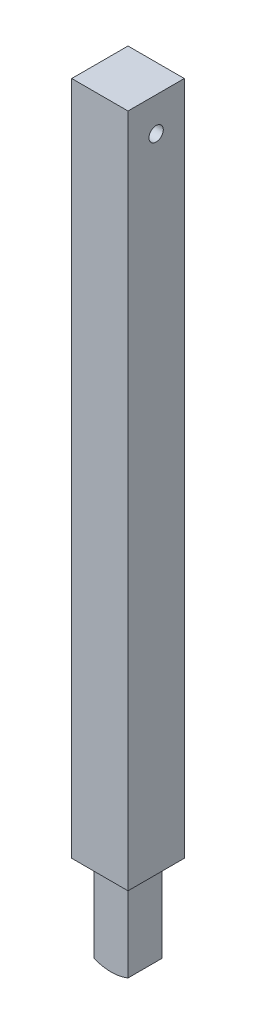
ISO-10303-21;
HEADER;
FILE_DESCRIPTION(('STEP AP214'),'2;1');
FILE_NAME('part.step','',(''),(''),'','','');
FILE_SCHEMA(('AUTOMOTIVE_DESIGN { 1 0 10303 214 1 1 1 1 }'));
ENDSEC;
DATA;
#1=APPLICATION_CONTEXT('core data for automotive mechanical design processes');
#2=APPLICATION_PROTOCOL_DEFINITION('international standard','automotive_design',2000,#1);
#3=PRODUCT_CONTEXT('',#1,'mechanical');
#4=PRODUCT('Part','Part','',(#3));
#5=PRODUCT_RELATED_PRODUCT_CATEGORY('part','',(#4));
#6=PRODUCT_DEFINITION_FORMATION('','',#4);
#7=PRODUCT_DEFINITION_CONTEXT('part definition',#1,'design');
#8=PRODUCT_DEFINITION('design','',#6,#7);
#9=PRODUCT_DEFINITION_SHAPE('','',#8);
#10=(LENGTH_UNIT() NAMED_UNIT(*) SI_UNIT(.MILLI.,.METRE.));
#11=(NAMED_UNIT(*) PLANE_ANGLE_UNIT() SI_UNIT($,.RADIAN.));
#12=(NAMED_UNIT(*) SI_UNIT($,.STERADIAN.) SOLID_ANGLE_UNIT());
#13=UNCERTAINTY_MEASURE_WITH_UNIT(LENGTH_MEASURE(1.E-05),#10,'distance_accuracy_value','');
#14=(GEOMETRIC_REPRESENTATION_CONTEXT(3) GLOBAL_UNCERTAINTY_ASSIGNED_CONTEXT((#13)) GLOBAL_UNIT_ASSIGNED_CONTEXT((#10,
#11,#12)) REPRESENTATION_CONTEXT('',''));
#15=CARTESIAN_POINT('',(0.,0.,0.));
#16=DIRECTION('',(0.,0.,1.));
#17=DIRECTION('',(1.,0.,0.));
#18=AXIS2_PLACEMENT_3D('',#15,#16,#17);
#19=CARTESIAN_POINT('',(-7.5,40.,-7.5));
#20=DIRECTION('',(0.,0.,1.));
#21=DIRECTION('',(1.,0.,0.));
#22=AXIS2_PLACEMENT_3D('',#19,#20,#21);
#23=PLANE('',#22);
#24=DIRECTION('',(0.,-1.,0.));
#25=VECTOR('',#24,1.);
#26=CARTESIAN_POINT('',(7.5,40.,-7.5));
#27=LINE('',#26,#25);
#28=CARTESIAN_POINT('',(7.5,40.,-7.5));
#29=VERTEX_POINT('',#28);
#30=CARTESIAN_POINT('',(7.5,1.45950378226084,-7.5));
#31=VERTEX_POINT('',#30);
#32=EDGE_CURVE('E12',#29,#31,#27,.T.);
#33=ORIENTED_EDGE('',*,*,#32,.T.);
#34=CARTESIAN_POINT('',(0.,20.,-7.5));
#35=DIRECTION('',(0.,0.,1.));
#36=DIRECTION('',(1.,0.,0.));
#37=AXIS2_PLACEMENT_3D('',#34,#35,#36);
#38=CIRCLE('',#37,20.);
#39=CARTESIAN_POINT('',(-7.5,1.45950378226084,-7.5));
#40=VERTEX_POINT('',#39);
#41=EDGE_CURVE('E150',#40,#31,#38,.T.);
#42=ORIENTED_EDGE('',*,*,#41,.F.);
#43=DIRECTION('',(0.,-1.,0.));
#44=VECTOR('',#43,1.);
#45=CARTESIAN_POINT('',(-7.5,40.,-7.5));
#46=LINE('',#45,#44);
#47=CARTESIAN_POINT('',(-7.5,40.,-7.5));
#48=VERTEX_POINT('',#47);
#49=EDGE_CURVE('E59',#48,#40,#46,.T.);
#50=ORIENTED_EDGE('',*,*,#49,.F.);
#51=DIRECTION('',(-1.,0.,0.));
#52=VECTOR('',#51,1.);
#53=CARTESIAN_POINT('',(-7.5,40.,-7.5));
#54=LINE('',#53,#52);
#55=EDGE_CURVE('E159',#29,#48,#54,.T.);
#56=ORIENTED_EDGE('',*,*,#55,.F.);
#57=EDGE_LOOP('',(#33,#42,#50,#56));
#58=FACE_BOUND('',#57,.T.);
#59=ADVANCED_FACE('F51',(#58),#23,.F.);
#60=CARTESIAN_POINT('',(-7.5,40.,7.5));
#61=DIRECTION('',(0.,0.,-1.));
#62=DIRECTION('',(-1.,0.,0.));
#63=AXIS2_PLACEMENT_3D('',#60,#61,#62);
#64=PLANE('',#63);
#65=CARTESIAN_POINT('',(0.,20.,7.5));
#66=DIRECTION('',(0.,0.,1.));
#67=DIRECTION('',(1.,0.,0.));
#68=AXIS2_PLACEMENT_3D('',#65,#66,#67);
#69=CIRCLE('',#68,20.);
#70=CARTESIAN_POINT('',(-7.5,1.45950378226084,7.5));
#71=VERTEX_POINT('',#70);
#72=CARTESIAN_POINT('',(7.5,1.45950378226084,7.5));
#73=VERTEX_POINT('',#72);
#74=EDGE_CURVE('E144',#71,#73,#69,.T.);
#75=ORIENTED_EDGE('',*,*,#74,.T.);
#76=DIRECTION('',(0.,-1.,0.));
#77=VECTOR('',#76,1.);
#78=CARTESIAN_POINT('',(7.5,40.,7.5));
#79=LINE('',#78,#77);
#80=CARTESIAN_POINT('',(7.5,40.,7.5));
#81=VERTEX_POINT('',#80);
#82=EDGE_CURVE('E66',#81,#73,#79,.T.);
#83=ORIENTED_EDGE('',*,*,#82,.F.);
#84=DIRECTION('',(1.,0.,0.));
#85=VECTOR('',#84,1.);
#86=CARTESIAN_POINT('',(-7.5,40.,7.5));
#87=LINE('',#86,#85);
#88=CARTESIAN_POINT('',(-7.5,40.,7.5));
#89=VERTEX_POINT('',#88);
#90=EDGE_CURVE('E165',#89,#81,#87,.T.);
#91=ORIENTED_EDGE('',*,*,#90,.F.);
#92=DIRECTION('',(0.,-1.,0.));
#93=VECTOR('',#92,1.);
#94=CARTESIAN_POINT('',(-7.5,40.,7.5));
#95=LINE('',#94,#93);
#96=EDGE_CURVE('E169',#89,#71,#95,.T.);
#97=ORIENTED_EDGE('',*,*,#96,.T.);
#98=EDGE_LOOP('',(#75,#83,#91,#97));
#99=FACE_BOUND('',#98,.T.);
#100=ADVANCED_FACE('F181',(#99),#64,.F.);
#101=CARTESIAN_POINT('',(7.5,40.,7.5));
#102=DIRECTION('',(-1.,0.,0.));
#103=DIRECTION('',(0.,0.,1.));
#104=AXIS2_PLACEMENT_3D('',#101,#102,#103);
#105=PLANE('',#104);
#106=DIRECTION('',(0.,0.,1.));
#107=VECTOR('',#106,1.);
#108=CARTESIAN_POINT('',(7.5,1.45950378226084,-7.5));
#109=LINE('',#108,#107);
#110=EDGE_CURVE('E141',#31,#73,#109,.T.);
#111=ORIENTED_EDGE('',*,*,#110,.F.);
#112=ORIENTED_EDGE('',*,*,#32,.F.);
#113=DIRECTION('',(0.,0.,-1.));
#114=VECTOR('',#113,1.);
#115=CARTESIAN_POINT('',(7.5,40.,7.5));
#116=LINE('',#115,#114);
#117=EDGE_CURVE('E156',#81,#29,#116,.T.);
#118=ORIENTED_EDGE('',*,*,#117,.F.);
#119=ORIENTED_EDGE('',*,*,#82,.T.);
#120=EDGE_LOOP('',(#111,#112,#118,#119));
#121=FACE_BOUND('',#120,.T.);
#122=ADVANCED_FACE('F53',(#121),#105,.F.);
#123=CARTESIAN_POINT('',(-7.5,40.,7.5));
#124=DIRECTION('',(1.,0.,0.));
#125=DIRECTION('',(0.,0.,-1.));
#126=AXIS2_PLACEMENT_3D('',#123,#124,#125);
#127=PLANE('',#126);
#128=DIRECTION('',(0.,0.,1.));
#129=VECTOR('',#128,1.);
#130=CARTESIAN_POINT('',(-7.5,1.45950378226084,-7.5));
#131=LINE('',#130,#129);
#132=EDGE_CURVE('E152',#40,#71,#131,.T.);
#133=ORIENTED_EDGE('',*,*,#132,.T.);
#134=ORIENTED_EDGE('',*,*,#96,.F.);
#135=DIRECTION('',(0.,0.,1.));
#136=VECTOR('',#135,1.);
#137=CARTESIAN_POINT('',(-7.5,40.,7.5));
#138=LINE('',#137,#136);
#139=EDGE_CURVE('E162',#48,#89,#138,.T.);
#140=ORIENTED_EDGE('',*,*,#139,.F.);
#141=ORIENTED_EDGE('',*,*,#49,.T.);
#142=EDGE_LOOP('',(#133,#134,#140,#141));
#143=FACE_BOUND('',#142,.T.);
#144=ADVANCED_FACE('F172',(#143),#127,.F.);
#145=CARTESIAN_POINT('',(0.,20.,-7.5));
#146=DIRECTION('',(0.,0.,1.));
#147=DIRECTION('',(1.,0.,0.));
#148=AXIS2_PLACEMENT_3D('',#145,#146,#147);
#149=CYLINDRICAL_SURFACE('',#148,20.);
#150=ORIENTED_EDGE('',*,*,#74,.F.);
#151=ORIENTED_EDGE('',*,*,#132,.F.);
#152=ORIENTED_EDGE('',*,*,#41,.T.);
#153=ORIENTED_EDGE('',*,*,#110,.T.);
#154=EDGE_LOOP('',(#150,#151,#152,#153));
#155=FACE_BOUND('',#154,.T.);
#156=ADVANCED_FACE('F180',(#155),#149,.T.);
#157=CARTESIAN_POINT('',(0.,40.,0.));
#158=DIRECTION('',(0.,1.,0.));
#159=DIRECTION('',(0.,0.,1.));
#160=AXIS2_PLACEMENT_3D('',#157,#158,#159);
#161=PLANE('',#160);
#162=DIRECTION('',(0.,0.,-1.));
#163=VECTOR('',#162,1.);
#164=CARTESIAN_POINT('',(12.5,40.,-12.5));
#165=LINE('',#164,#163);
#166=CARTESIAN_POINT('',(12.5,40.,12.5));
#167=VERTEX_POINT('',#166);
#168=CARTESIAN_POINT('',(12.5,40.,-12.5));
#169=VERTEX_POINT('',#168);
#170=EDGE_CURVE('E140',#167,#169,#165,.T.);
#171=ORIENTED_EDGE('',*,*,#170,.F.);
#172=DIRECTION('',(1.,0.,0.));
#173=VECTOR('',#172,1.);
#174=CARTESIAN_POINT('',(-12.5,40.,12.5));
#175=LINE('',#174,#173);
#176=CARTESIAN_POINT('',(-12.5,40.,12.5));
#177=VERTEX_POINT('',#176);
#178=EDGE_CURVE('E136',#177,#167,#175,.T.);
#179=ORIENTED_EDGE('',*,*,#178,.F.);
#180=DIRECTION('',(0.,0.,1.));
#181=VECTOR('',#180,1.);
#182=CARTESIAN_POINT('',(-12.5,40.,-12.5));
#183=LINE('',#182,#181);
#184=CARTESIAN_POINT('',(-12.5,40.,-12.5));
#185=VERTEX_POINT('',#184);
#186=EDGE_CURVE('E303',#185,#177,#183,.T.);
#187=ORIENTED_EDGE('',*,*,#186,.F.);
#188=DIRECTION('',(-1.,0.,0.));
#189=VECTOR('',#188,1.);
#190=CARTESIAN_POINT('',(-12.5,40.,-12.5));
#191=LINE('',#190,#189);
#192=EDGE_CURVE('E301',#169,#185,#191,.T.);
#193=ORIENTED_EDGE('',*,*,#192,.F.);
#194=EDGE_LOOP('',(#171,#179,#187,#193));
#195=FACE_BOUND('',#194,.T.);
#196=ORIENTED_EDGE('',*,*,#90,.T.);
#197=ORIENTED_EDGE('',*,*,#117,.T.);
#198=ORIENTED_EDGE('',*,*,#55,.T.);
#199=ORIENTED_EDGE('',*,*,#139,.T.);
#200=EDGE_LOOP('',(#196,#197,#198,#199));
#201=FACE_BOUND('',#200,.T.);
#202=ADVANCED_FACE('F175',(#195,#201),#161,.F.);
#203=CARTESIAN_POINT('',(12.5,340.,-12.5));
#204=DIRECTION('',(-1.,0.,0.));
#205=DIRECTION('',(0.,0.,1.));
#206=AXIS2_PLACEMENT_3D('',#203,#204,#205);
#207=PLANE('',#206);
#208=CARTESIAN_POINT('',(12.5,325.,0.));
#209=DIRECTION('',(1.,0.,0.));
#210=DIRECTION('',(0.,0.,-1.));
#211=AXIS2_PLACEMENT_3D('',#208,#209,#210);
#212=CIRCLE('',#211,3.17499999999998);
#213=CARTESIAN_POINT('',(12.5,325.,-3.17499999999998));
#214=VERTEX_POINT('',#213);
#215=EDGE_CURVE('E293',#214,#214,#212,.T.);
#216=ORIENTED_EDGE('',*,*,#215,.F.);
#217=EDGE_LOOP('',(#216));
#218=FACE_BOUND('',#217,.T.);
#219=ORIENTED_EDGE('',*,*,#170,.T.);
#220=DIRECTION('',(0.,-1.,0.));
#221=VECTOR('',#220,1.);
#222=CARTESIAN_POINT('',(12.5,340.,-12.5));
#223=LINE('',#222,#221);
#224=CARTESIAN_POINT('',(12.5,340.,-12.5));
#225=VERTEX_POINT('',#224);
#226=EDGE_CURVE('E120',#225,#169,#223,.T.);
#227=ORIENTED_EDGE('',*,*,#226,.F.);
#228=DIRECTION('',(0.,0.,-1.));
#229=VECTOR('',#228,1.);
#230=CARTESIAN_POINT('',(12.5,340.,-12.5));
#231=LINE('',#230,#229);
#232=CARTESIAN_POINT('',(12.5,340.,12.5));
#233=VERTEX_POINT('',#232);
#234=EDGE_CURVE('E127',#233,#225,#231,.T.);
#235=ORIENTED_EDGE('',*,*,#234,.F.);
#236=DIRECTION('',(0.,-1.,0.));
#237=VECTOR('',#236,1.);
#238=CARTESIAN_POINT('',(12.5,340.,12.5));
#239=LINE('',#238,#237);
#240=EDGE_CURVE('E299',#233,#167,#239,.T.);
#241=ORIENTED_EDGE('',*,*,#240,.T.);
#242=EDGE_LOOP('',(#219,#227,#235,#241));
#243=FACE_BOUND('',#242,.T.);
#244=ADVANCED_FACE('F138',(#218,#243),#207,.F.);
#245=CARTESIAN_POINT('',(-12.5,340.,-12.5));
#246=DIRECTION('',(0.,0.,1.));
#247=DIRECTION('',(1.,0.,0.));
#248=AXIS2_PLACEMENT_3D('',#245,#246,#247);
#249=PLANE('',#248);
#250=ORIENTED_EDGE('',*,*,#192,.T.);
#251=DIRECTION('',(0.,-1.,0.));
#252=VECTOR('',#251,1.);
#253=CARTESIAN_POINT('',(-12.5,340.,-12.5));
#254=LINE('',#253,#252);
#255=CARTESIAN_POINT('',(-12.5,340.,-12.5));
#256=VERTEX_POINT('',#255);
#257=EDGE_CURVE('E123',#256,#185,#254,.T.);
#258=ORIENTED_EDGE('',*,*,#257,.F.);
#259=DIRECTION('',(-1.,0.,0.));
#260=VECTOR('',#259,1.);
#261=CARTESIAN_POINT('',(-12.5,340.,-12.5));
#262=LINE('',#261,#260);
#263=EDGE_CURVE('E116',#225,#256,#262,.T.);
#264=ORIENTED_EDGE('',*,*,#263,.F.);
#265=ORIENTED_EDGE('',*,*,#226,.T.);
#266=EDGE_LOOP('',(#250,#258,#264,#265));
#267=FACE_BOUND('',#266,.T.);
#268=ADVANCED_FACE('F118',(#267),#249,.F.);
#269=CARTESIAN_POINT('',(-12.5,340.,-12.5));
#270=DIRECTION('',(1.,0.,0.));
#271=DIRECTION('',(0.,0.,-1.));
#272=AXIS2_PLACEMENT_3D('',#269,#270,#271);
#273=PLANE('',#272);
#274=CARTESIAN_POINT('',(-12.5,325.,0.));
#275=DIRECTION('',(1.,0.,0.));
#276=DIRECTION('',(0.,0.,-1.));
#277=AXIS2_PLACEMENT_3D('',#274,#275,#276);
#278=CIRCLE('',#277,3.17499999999998);
#279=CARTESIAN_POINT('',(-12.5,325.,-3.17499999999998));
#280=VERTEX_POINT('',#279);
#281=EDGE_CURVE('E290',#280,#280,#278,.T.);
#282=ORIENTED_EDGE('',*,*,#281,.T.);
#283=EDGE_LOOP('',(#282));
#284=FACE_BOUND('',#283,.T.);
#285=ORIENTED_EDGE('',*,*,#186,.T.);
#286=DIRECTION('',(0.,-1.,0.));
#287=VECTOR('',#286,1.);
#288=CARTESIAN_POINT('',(-12.5,340.,12.5));
#289=LINE('',#288,#287);
#290=CARTESIAN_POINT('',(-12.5,340.,12.5));
#291=VERTEX_POINT('',#290);
#292=EDGE_CURVE('E146',#291,#177,#289,.T.);
#293=ORIENTED_EDGE('',*,*,#292,.F.);
#294=DIRECTION('',(0.,0.,1.));
#295=VECTOR('',#294,1.);
#296=CARTESIAN_POINT('',(-12.5,340.,-12.5));
#297=LINE('',#296,#295);
#298=EDGE_CURVE('E126',#256,#291,#297,.T.);
#299=ORIENTED_EDGE('',*,*,#298,.F.);
#300=ORIENTED_EDGE('',*,*,#257,.T.);
#301=EDGE_LOOP('',(#285,#293,#299,#300));
#302=FACE_BOUND('',#301,.T.);
#303=ADVANCED_FACE('F211',(#284,#302),#273,.F.);
#304=CARTESIAN_POINT('',(-12.5,340.,12.5));
#305=DIRECTION('',(0.,0.,-1.));
#306=DIRECTION('',(-1.,0.,0.));
#307=AXIS2_PLACEMENT_3D('',#304,#305,#306);
#308=PLANE('',#307);
#309=ORIENTED_EDGE('',*,*,#178,.T.);
#310=ORIENTED_EDGE('',*,*,#240,.F.);
#311=DIRECTION('',(1.,0.,0.));
#312=VECTOR('',#311,1.);
#313=CARTESIAN_POINT('',(-12.5,340.,12.5));
#314=LINE('',#313,#312);
#315=EDGE_CURVE('E132',#291,#233,#314,.T.);
#316=ORIENTED_EDGE('',*,*,#315,.F.);
#317=ORIENTED_EDGE('',*,*,#292,.T.);
#318=EDGE_LOOP('',(#309,#310,#316,#317));
#319=FACE_BOUND('',#318,.T.);
#320=ADVANCED_FACE('F208',(#319),#308,.F.);
#321=CARTESIAN_POINT('',(0.,340.,0.));
#322=DIRECTION('',(0.,1.,0.));
#323=DIRECTION('',(0.,0.,1.));
#324=AXIS2_PLACEMENT_3D('',#321,#322,#323);
#325=PLANE('',#324);
#326=ORIENTED_EDGE('',*,*,#234,.T.);
#327=ORIENTED_EDGE('',*,*,#263,.T.);
#328=ORIENTED_EDGE('',*,*,#298,.T.);
#329=ORIENTED_EDGE('',*,*,#315,.T.);
#330=EDGE_LOOP('',(#326,#327,#328,#329));
#331=FACE_BOUND('',#330,.T.);
#332=ADVANCED_FACE('F130',(#331),#325,.T.);
#333=CARTESIAN_POINT('',(12.5,325.,0.));
#334=DIRECTION('',(1.,0.,0.));
#335=DIRECTION('',(0.,0.,-1.));
#336=AXIS2_PLACEMENT_3D('',#333,#334,#335);
#337=CYLINDRICAL_SURFACE('',#336,3.17499999999998);
#338=ORIENTED_EDGE('',*,*,#281,.F.);
#339=EDGE_LOOP('',(#338));
#340=FACE_BOUND('',#339,.T.);
#341=ORIENTED_EDGE('',*,*,#215,.T.);
#342=EDGE_LOOP('',(#341));
#343=FACE_BOUND('',#342,.T.);
#344=ADVANCED_FACE('F236',(#340,#343),#337,.F.);
#345=CLOSED_SHELL('',(#59,#100,#122,#144,#156,#202,#244,#268,#303,#320,#332,#344));
#346=MANIFOLD_SOLID_BREP('B2',#345);
#347=ADVANCED_BREP_SHAPE_REPRESENTATION('',(#18,#346),#14);
#348=SHAPE_DEFINITION_REPRESENTATION(#9,#347);
ENDSEC;
END-ISO-10303-21;
